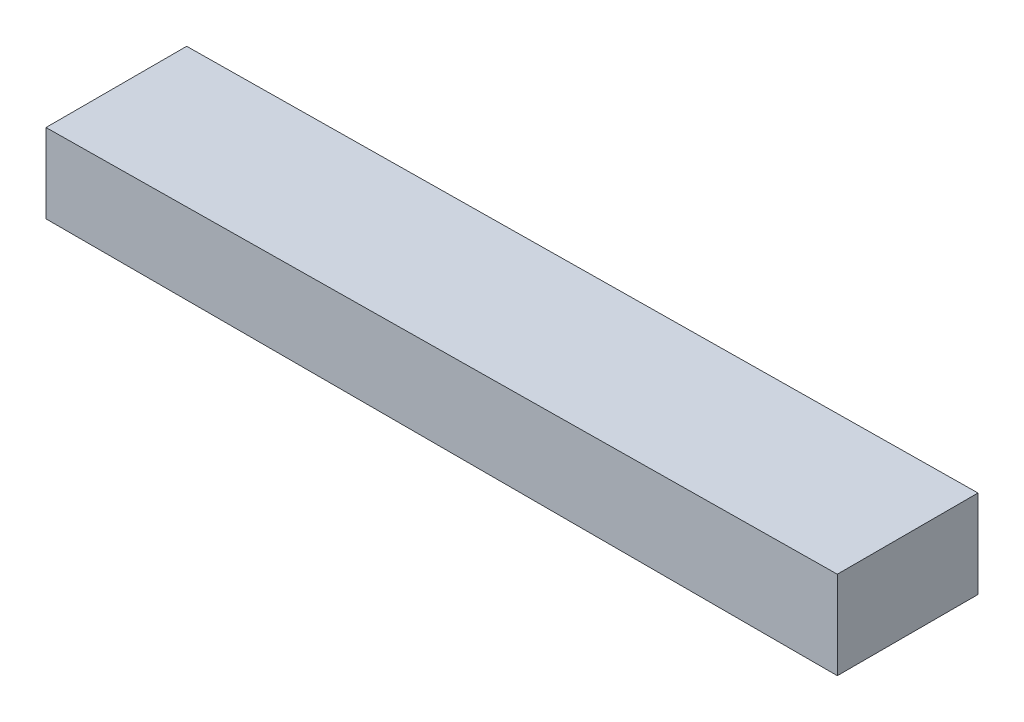
ISO-10303-21;
HEADER;
FILE_DESCRIPTION(('STEP AP214'),'2;1');
FILE_NAME('part.step','',(''),(''),'','','');
FILE_SCHEMA(('AUTOMOTIVE_DESIGN { 1 0 10303 214 1 1 1 1 }'));
ENDSEC;
DATA;
#1=APPLICATION_CONTEXT('core data for automotive mechanical design processes');
#2=APPLICATION_PROTOCOL_DEFINITION('international standard','automotive_design',2000,#1);
#3=PRODUCT_CONTEXT('',#1,'mechanical');
#4=PRODUCT('Part','Part','',(#3));
#5=PRODUCT_RELATED_PRODUCT_CATEGORY('part','',(#4));
#6=PRODUCT_DEFINITION_FORMATION('','',#4);
#7=PRODUCT_DEFINITION_CONTEXT('part definition',#1,'design');
#8=PRODUCT_DEFINITION('design','',#6,#7);
#9=PRODUCT_DEFINITION_SHAPE('','',#8);
#10=(LENGTH_UNIT() NAMED_UNIT(*) SI_UNIT(.MILLI.,.METRE.));
#11=(NAMED_UNIT(*) PLANE_ANGLE_UNIT() SI_UNIT($,.RADIAN.));
#12=(NAMED_UNIT(*) SI_UNIT($,.STERADIAN.) SOLID_ANGLE_UNIT());
#13=UNCERTAINTY_MEASURE_WITH_UNIT(LENGTH_MEASURE(1.E-05),#10,'distance_accuracy_value','');
#14=(GEOMETRIC_REPRESENTATION_CONTEXT(3) GLOBAL_UNCERTAINTY_ASSIGNED_CONTEXT((#13)) GLOBAL_UNIT_ASSIGNED_CONTEXT((#10,
#11,#12)) REPRESENTATION_CONTEXT('',''));
#15=CARTESIAN_POINT('',(0.,0.,0.));
#16=DIRECTION('',(0.,0.,1.));
#17=DIRECTION('',(1.,0.,0.));
#18=AXIS2_PLACEMENT_3D('',#15,#16,#17);
#19=CARTESIAN_POINT('',(0.,9.,16.));
#20=DIRECTION('',(1.,0.,0.));
#21=DIRECTION('',(0.,1.,0.));
#22=AXIS2_PLACEMENT_3D('',#19,#20,#21);
#23=PLANE('',#22);
#24=DIRECTION('',(0.,-1.,0.));
#25=VECTOR('',#24,1.);
#26=CARTESIAN_POINT('',(0.,9.,0.));
#27=LINE('',#26,#25);
#28=CARTESIAN_POINT('',(0.,9.,0.));
#29=VERTEX_POINT('',#28);
#30=CARTESIAN_POINT('',(0.,0.,0.));
#31=VERTEX_POINT('',#30);
#32=EDGE_CURVE('E95',#29,#31,#27,.T.);
#33=ORIENTED_EDGE('',*,*,#32,.T.);
#34=DIRECTION('',(0.,0.,-1.));
#35=VECTOR('',#34,1.);
#36=CARTESIAN_POINT('',(0.,0.,16.));
#37=LINE('',#36,#35);
#38=CARTESIAN_POINT('',(0.,0.,16.));
#39=VERTEX_POINT('',#38);
#40=EDGE_CURVE('E11',#39,#31,#37,.T.);
#41=ORIENTED_EDGE('',*,*,#40,.F.);
#42=DIRECTION('',(0.,-1.,0.));
#43=VECTOR('',#42,1.);
#44=CARTESIAN_POINT('',(0.,9.,16.));
#45=LINE('',#44,#43);
#46=CARTESIAN_POINT('',(0.,9.,16.));
#47=VERTEX_POINT('',#46);
#48=EDGE_CURVE('E83',#47,#39,#45,.T.);
#49=ORIENTED_EDGE('',*,*,#48,.F.);
#50=DIRECTION('',(0.,0.,-1.));
#51=VECTOR('',#50,1.);
#52=CARTESIAN_POINT('',(0.,9.,16.));
#53=LINE('',#52,#51);
#54=EDGE_CURVE('E91',#47,#29,#53,.T.);
#55=ORIENTED_EDGE('',*,*,#54,.T.);
#56=EDGE_LOOP('',(#33,#41,#49,#55));
#57=FACE_BOUND('',#56,.T.);
#58=ADVANCED_FACE('F32',(#57),#23,.F.);
#59=CARTESIAN_POINT('',(0.,0.,16.));
#60=DIRECTION('',(0.,1.,0.));
#61=DIRECTION('',(0.,0.,1.));
#62=AXIS2_PLACEMENT_3D('',#59,#60,#61);
#63=PLANE('',#62);
#64=DIRECTION('',(1.,0.,0.));
#65=VECTOR('',#64,1.);
#66=CARTESIAN_POINT('',(0.,0.,0.));
#67=LINE('',#66,#65);
#68=CARTESIAN_POINT('',(90.,0.,0.));
#69=VERTEX_POINT('',#68);
#70=EDGE_CURVE('E87',#31,#69,#67,.T.);
#71=ORIENTED_EDGE('',*,*,#70,.T.);
#72=DIRECTION('',(0.,0.,-1.));
#73=VECTOR('',#72,1.);
#74=CARTESIAN_POINT('',(90.,0.,16.));
#75=LINE('',#74,#73);
#76=CARTESIAN_POINT('',(90.,0.,16.));
#77=VERTEX_POINT('',#76);
#78=EDGE_CURVE('E40',#77,#69,#75,.T.);
#79=ORIENTED_EDGE('',*,*,#78,.F.);
#80=DIRECTION('',(1.,0.,0.));
#81=VECTOR('',#80,1.);
#82=CARTESIAN_POINT('',(0.,0.,16.));
#83=LINE('',#82,#81);
#84=EDGE_CURVE('E78',#39,#77,#83,.T.);
#85=ORIENTED_EDGE('',*,*,#84,.F.);
#86=ORIENTED_EDGE('',*,*,#40,.T.);
#87=EDGE_LOOP('',(#71,#79,#85,#86));
#88=FACE_BOUND('',#87,.T.);
#89=ADVANCED_FACE('F86',(#88),#63,.F.);
#90=CARTESIAN_POINT('',(90.,0.,16.));
#91=DIRECTION('',(-1.,0.,0.));
#92=DIRECTION('',(0.,0.,1.));
#93=AXIS2_PLACEMENT_3D('',#90,#91,#92);
#94=PLANE('',#93);
#95=DIRECTION('',(0.,1.,0.));
#96=VECTOR('',#95,1.);
#97=CARTESIAN_POINT('',(90.,0.,0.));
#98=LINE('',#97,#96);
#99=CARTESIAN_POINT('',(90.,10.,0.));
#100=VERTEX_POINT('',#99);
#101=EDGE_CURVE('E65',#69,#100,#98,.T.);
#102=ORIENTED_EDGE('',*,*,#101,.T.);
#103=DIRECTION('',(0.,0.,-1.));
#104=VECTOR('',#103,1.);
#105=CARTESIAN_POINT('',(90.,10.,16.));
#106=LINE('',#105,#104);
#107=CARTESIAN_POINT('',(90.,10.,16.));
#108=VERTEX_POINT('',#107);
#109=EDGE_CURVE('E88',#108,#100,#106,.T.);
#110=ORIENTED_EDGE('',*,*,#109,.F.);
#111=DIRECTION('',(0.,1.,0.));
#112=VECTOR('',#111,1.);
#113=CARTESIAN_POINT('',(90.,0.,16.));
#114=LINE('',#113,#112);
#115=EDGE_CURVE('E81',#77,#108,#114,.T.);
#116=ORIENTED_EDGE('',*,*,#115,.F.);
#117=ORIENTED_EDGE('',*,*,#78,.T.);
#118=EDGE_LOOP('',(#102,#110,#116,#117));
#119=FACE_BOUND('',#118,.T.);
#120=ADVANCED_FACE('F89',(#119),#94,.F.);
#121=CARTESIAN_POINT('',(90.,10.,16.));
#122=DIRECTION('',(0.0111104253035549,-0.999938277319943,0.));
#123=DIRECTION('',(0.999938277319943,0.0111104253035549,0.));
#124=AXIS2_PLACEMENT_3D('',#121,#122,#123);
#125=PLANE('',#124);
#126=DIRECTION('',(-0.999938277319943,-0.0111104253035549,0.));
#127=VECTOR('',#126,1.);
#128=CARTESIAN_POINT('',(90.,10.,0.));
#129=LINE('',#128,#127);
#130=EDGE_CURVE('E71',#100,#29,#129,.T.);
#131=ORIENTED_EDGE('',*,*,#130,.T.);
#132=ORIENTED_EDGE('',*,*,#54,.F.);
#133=DIRECTION('',(-0.999938277319943,-0.0111104253035549,0.));
#134=VECTOR('',#133,1.);
#135=CARTESIAN_POINT('',(90.,10.,16.));
#136=LINE('',#135,#134);
#137=EDGE_CURVE('E48',#108,#47,#136,.T.);
#138=ORIENTED_EDGE('',*,*,#137,.F.);
#139=ORIENTED_EDGE('',*,*,#109,.T.);
#140=EDGE_LOOP('',(#131,#132,#138,#139));
#141=FACE_BOUND('',#140,.T.);
#142=ADVANCED_FACE('F102',(#141),#125,.F.);
#143=CARTESIAN_POINT('',(0.,0.,16.));
#144=DIRECTION('',(0.,0.,1.));
#145=DIRECTION('',(1.,0.,0.));
#146=AXIS2_PLACEMENT_3D('',#143,#144,#145);
#147=PLANE('',#146);
#148=ORIENTED_EDGE('',*,*,#48,.T.);
#149=ORIENTED_EDGE('',*,*,#84,.T.);
#150=ORIENTED_EDGE('',*,*,#115,.T.);
#151=ORIENTED_EDGE('',*,*,#137,.T.);
#152=EDGE_LOOP('',(#148,#149,#150,#151));
#153=FACE_BOUND('',#152,.T.);
#154=ADVANCED_FACE('F79',(#153),#147,.T.);
#155=CARTESIAN_POINT('',(0.,0.,0.));
#156=DIRECTION('',(0.,0.,1.));
#157=DIRECTION('',(1.,0.,0.));
#158=AXIS2_PLACEMENT_3D('',#155,#156,#157);
#159=PLANE('',#158);
#160=ORIENTED_EDGE('',*,*,#32,.F.);
#161=ORIENTED_EDGE('',*,*,#130,.F.);
#162=ORIENTED_EDGE('',*,*,#101,.F.);
#163=ORIENTED_EDGE('',*,*,#70,.F.);
#164=EDGE_LOOP('',(#160,#161,#162,#163));
#165=FACE_BOUND('',#164,.T.);
#166=ADVANCED_FACE('F105',(#165),#159,.F.);
#167=CLOSED_SHELL('',(#58,#89,#120,#142,#154,#166));
#168=MANIFOLD_SOLID_BREP('B2',#167);
#169=ADVANCED_BREP_SHAPE_REPRESENTATION('',(#18,#168),#14);
#170=SHAPE_DEFINITION_REPRESENTATION(#9,#169);
ENDSEC;
END-ISO-10303-21;
